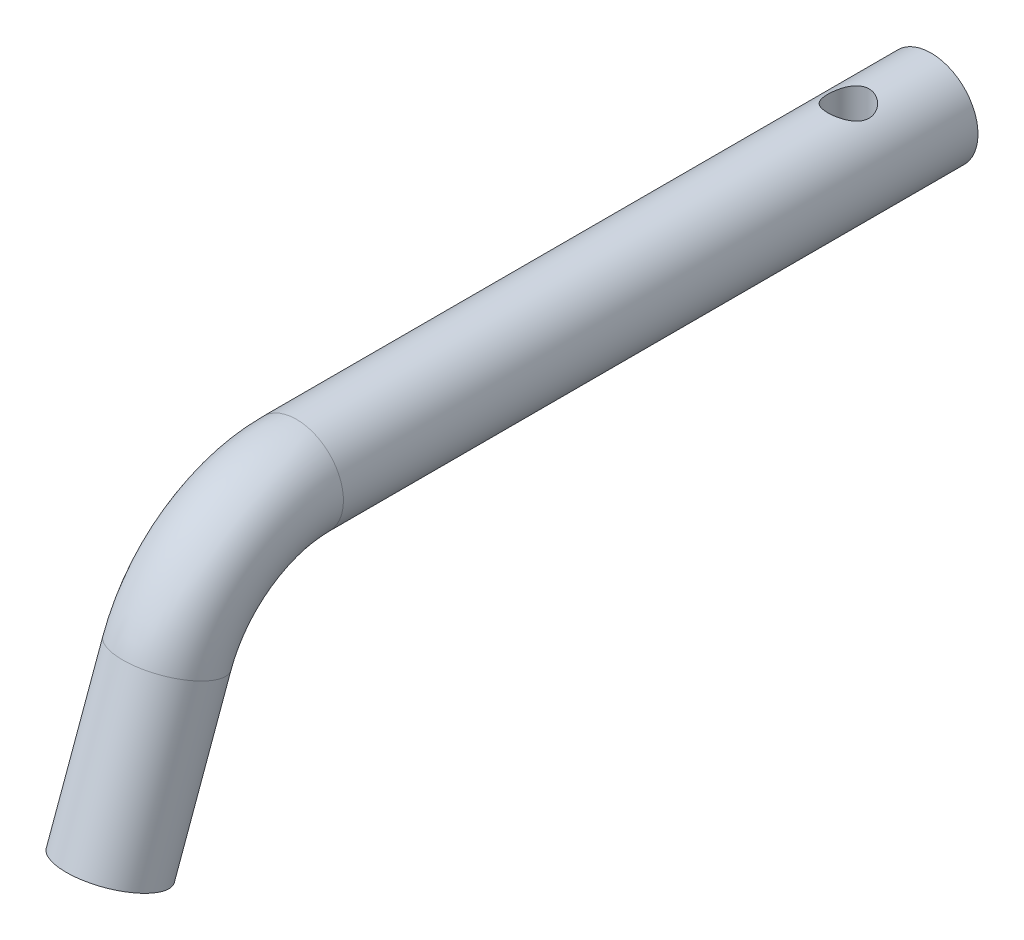
ISO-10303-21;
HEADER;
FILE_DESCRIPTION(('STEP AP214'),'2;1');
FILE_NAME('part.step','',(''),(''),'','','');
FILE_SCHEMA(('AUTOMOTIVE_DESIGN { 1 0 10303 214 1 1 1 1 }'));
ENDSEC;
DATA;
#1=APPLICATION_CONTEXT('core data for automotive mechanical design processes');
#2=APPLICATION_PROTOCOL_DEFINITION('international standard','automotive_design',2000,#1);
#3=PRODUCT_CONTEXT('',#1,'mechanical');
#4=PRODUCT('Part','Part','',(#3));
#5=PRODUCT_RELATED_PRODUCT_CATEGORY('part','',(#4));
#6=PRODUCT_DEFINITION_FORMATION('','',#4);
#7=PRODUCT_DEFINITION_CONTEXT('part definition',#1,'design');
#8=PRODUCT_DEFINITION('design','',#6,#7);
#9=PRODUCT_DEFINITION_SHAPE('','',#8);
#10=(LENGTH_UNIT() NAMED_UNIT(*) SI_UNIT(.MILLI.,.METRE.));
#11=(NAMED_UNIT(*) PLANE_ANGLE_UNIT() SI_UNIT($,.RADIAN.));
#12=(NAMED_UNIT(*) SI_UNIT($,.STERADIAN.) SOLID_ANGLE_UNIT());
#13=UNCERTAINTY_MEASURE_WITH_UNIT(LENGTH_MEASURE(1.E-05),#10,'distance_accuracy_value','');
#14=(GEOMETRIC_REPRESENTATION_CONTEXT(3) GLOBAL_UNCERTAINTY_ASSIGNED_CONTEXT((#13)) GLOBAL_UNIT_ASSIGNED_CONTEXT((#10,
#11,#12)) REPRESENTATION_CONTEXT('',''));
#15=CARTESIAN_POINT('',(0.,0.,0.));
#16=DIRECTION('',(0.,0.,1.));
#17=DIRECTION('',(1.,0.,0.));
#18=AXIS2_PLACEMENT_3D('',#15,#16,#17);
#19=CARTESIAN_POINT('',(0.,-16.4494964168584,138.492315519648));
#20=DIRECTION('',(0.,-0.93969262078591,0.342020143325665));
#21=DIRECTION('',(0.,-0.342020143325665,-0.93969262078591));
#22=AXIS2_PLACEMENT_3D('',#19,#20,#21);
#23=CYLINDRICAL_SURFACE('',#22,8.5);
#24=CARTESIAN_POINT('',(0.,-16.4494964168584,138.492315519648));
#25=DIRECTION('',(0.,-0.93969262078591,0.342020143325665));
#26=DIRECTION('',(1.,0.,0.));
#27=AXIS2_PLACEMENT_3D('',#24,#25,#26);
#28=CIRCLE('',#27,8.5);
#29=CARTESIAN_POINT('',(0.,-13.5423251985902,146.479702796328));
#30=VERTEX_POINT('',#29);
#31=EDGE_CURVE('E53',#30,#30,#28,.T.);
#32=ORIENTED_EDGE('',*,*,#31,.T.);
#33=EDGE_LOOP('',(#32));
#34=FACE_BOUND('',#33,.T.);
#35=CARTESIAN_POINT('',(0.,-44.6402750404357,148.752919819418));
#36=DIRECTION('',(0.,-0.93969262078591,0.342020143325665));
#37=DIRECTION('',(1.,0.,0.));
#38=AXIS2_PLACEMENT_3D('',#35,#36,#37);
#39=CIRCLE('',#38,8.5);
#40=CARTESIAN_POINT('',(8.5,-44.6402750404357,148.752919819418));
#41=VERTEX_POINT('',#40);
#42=EDGE_CURVE('E49',#41,#41,#39,.T.);
#43=ORIENTED_EDGE('',*,*,#42,.F.);
#44=EDGE_LOOP('',(#43));
#45=FACE_BOUND('',#44,.T.);
#46=ADVANCED_FACE('F37',(#34,#45),#23,.T.);
#47=CARTESIAN_POINT('',(0.,-25.,115.));
#48=DIRECTION('',(1.,0.,0.));
#49=DIRECTION('',(0.,0.,-1.));
#50=AXIS2_PLACEMENT_3D('',#47,#48,#49);
#51=TOROIDAL_SURFACE('',#50,25.,8.5);
#52=CARTESIAN_POINT('',(0.,0.,115.));
#53=DIRECTION('',(0.,0.,1.));
#54=DIRECTION('',(1.,0.,0.));
#55=AXIS2_PLACEMENT_3D('',#52,#53,#54);
#56=CIRCLE('',#55,8.5);
#57=CARTESIAN_POINT('',(0.,8.49999999999999,115.));
#58=VERTEX_POINT('',#57);
#59=EDGE_CURVE('E90',#58,#58,#56,.T.);
#60=CARTESIAN_POINT('',(0.,-25.,115.));
#61=DIRECTION('',(1.,0.,0.));
#62=DIRECTION('',(0.,0.,-1.));
#63=AXIS2_PLACEMENT_3D('',#60,#61,#62);
#64=CIRCLE('',#63,33.5);
#65=EDGE_CURVE('',#58,#30,#64,.T.);
#66=ORIENTED_EDGE('',*,*,#59,.T.);
#67=ORIENTED_EDGE('',*,*,#31,.F.);
#68=ORIENTED_EDGE('',*,*,#65,.T.);
#69=ORIENTED_EDGE('',*,*,#65,.F.);
#70=EDGE_LOOP('',(#66,#68,#67,#69));
#71=FACE_BOUND('',#70,.T.);
#72=ADVANCED_FACE('F79',(#71),#51,.T.);
#73=CARTESIAN_POINT('',(0.,0.,115.));
#74=DIRECTION('',(0.,0.,-1.));
#75=DIRECTION('',(0.,1.,0.));
#76=AXIS2_PLACEMENT_3D('',#73,#74,#75);
#77=CYLINDRICAL_SURFACE('',#76,8.5);
#78=CARTESIAN_POINT('',(0.,-8.5,18.75));
#79=CARTESIAN_POINT('',(0.0999558976515022,-8.49999935890844,18.7499992165375));
#80=CARTESIAN_POINT('',(0.199938526379386,-8.49823205416327,18.7459980516516));
#81=CARTESIAN_POINT('',(0.399183516955161,-8.49120739478633,18.7300338361352));
#82=CARTESIAN_POINT('',(0.498445428381363,-8.48594802055516,18.7180661781622));
#83=CARTESIAN_POINT('',(0.695663635366223,-8.47206199154958,18.6862638765181));
#84=CARTESIAN_POINT('',(0.793617095184538,-8.4634289644243,18.666414343956));
#85=CARTESIAN_POINT('',(0.987335915486304,-8.44302561349137,18.6190648021609));
#86=CARTESIAN_POINT('',(1.08310036413597,-8.43125400726226,18.5915616654686));
#87=CARTESIAN_POINT('',(1.36536799465597,-8.39175944741005,18.4981932684078));
#88=CARTESIAN_POINT('',(1.54777205362462,-8.35978735058802,18.421317012223));
#89=CARTESIAN_POINT('',(1.89680123675244,-8.2875822552758,18.2408834354046));
#90=CARTESIAN_POINT('',(2.06343008478846,-8.24735121352229,18.1373324331624));
#91=CARTESIAN_POINT('',(2.38574183002125,-8.16011458963587,17.9004620037884));
#92=CARTESIAN_POINT('',(2.54045490901277,-8.11287026790121,17.765908860382));
#93=CARTESIAN_POINT('',(2.82595491106934,-8.01789678469788,17.4735229534303));
#94=CARTESIAN_POINT('',(2.95672777935503,-7.97016735567651,17.3156766125287));
#95=CARTESIAN_POINT('',(3.19806253729727,-7.87655504691387,16.9701930209436));
#96=CARTESIAN_POINT('',(3.30705849547739,-7.83093021787193,16.7813742375152));
#97=CARTESIAN_POINT('',(3.44519682735577,-7.77065881681289,16.4849427900086));
#98=CARTESIAN_POINT('',(3.48702786737058,-7.75192386235585,16.3838916167599));
#99=CARTESIAN_POINT('',(3.56184065756976,-7.71783542854859,16.1780319851647));
#100=CARTESIAN_POINT('',(3.59482713302895,-7.70248014437289,16.0732255671525));
#101=CARTESIAN_POINT('',(3.65009428542046,-7.67643776880823,15.8661416684697));
#102=CARTESIAN_POINT('',(3.67283981158459,-7.66555057387276,15.764013041574));
#103=CARTESIAN_POINT('',(3.70974132852589,-7.64776048916769,15.5579157445523));
#104=CARTESIAN_POINT('',(3.72390143607776,-7.64085568988609,15.4539479809598));
#105=CARTESIAN_POINT('',(3.74345607757862,-7.63129451113794,15.2450311062506));
#106=CARTESIAN_POINT('',(3.74885356936061,-7.62863669810012,15.1400823383091));
#107=CARTESIAN_POINT('',(3.75081817583424,-7.62767097179327,14.9300868455599));
#108=CARTESIAN_POINT('',(3.74738584478112,-7.62936278549458,14.8250401273143));
#109=CARTESIAN_POINT('',(3.73242909578796,-7.63669005315726,14.6250012500233));
#110=CARTESIAN_POINT('',(3.72164546598027,-7.64196433893136,14.5299398184955));
#111=CARTESIAN_POINT('',(3.69290492351594,-7.65589310970095,14.341148080794));
#112=CARTESIAN_POINT('',(3.67494557684926,-7.6645487416301,14.2474182374793));
#113=CARTESIAN_POINT('',(3.61056059616382,-7.69520483570085,13.9692223515304));
#114=CARTESIAN_POINT('',(3.55361569812134,-7.72190105753058,13.7875896262777));
#115=CARTESIAN_POINT('',(3.41221100228373,-7.78542812649254,13.4326118958773));
#116=CARTESIAN_POINT('',(3.32716517690193,-7.82247197340192,13.259542532202));
#117=CARTESIAN_POINT('',(3.13237733872992,-7.90248622936272,12.9293801271241));
#118=CARTESIAN_POINT('',(3.02262499680422,-7.94545911426965,12.7722938078042));
#119=CARTESIAN_POINT('',(2.76921917904785,-8.03749074755006,12.4627429086084));
#120=CARTESIAN_POINT('',(2.62332475403702,-8.08673805046123,12.3121640900223));
#121=CARTESIAN_POINT('',(2.30793105087729,-8.18233433196054,12.0369318947019));
#122=CARTESIAN_POINT('',(2.13842486512249,-8.22868245662534,11.9122861313725));
#123=CARTESIAN_POINT('',(1.77429726877549,-8.31491541320456,11.6892265367902));
#124=CARTESIAN_POINT('',(1.57909441508011,-8.35457641986542,11.5916687886325));
#125=CARTESIAN_POINT('',(1.17284827377196,-8.42120408617829,11.4314542934501));
#126=CARTESIAN_POINT('',(0.961814917162525,-8.44817862851834,11.368775869837));
#127=CARTESIAN_POINT('',(0.545572567034578,-8.4848660971578,11.2842511022284));
#128=CARTESIAN_POINT('',(0.34097020009136,-8.49564384062029,11.2598805476027));
#129=CARTESIAN_POINT('',(-0.069671784856444,-8.50219123341189,11.2450279123634));
#130=CARTESIAN_POINT('',(-0.275710901369676,-8.4979658811345,11.2545345453155));
#131=CARTESIAN_POINT('',(-0.670962912504121,-8.47565881454487,11.3054425486727));
#132=CARTESIAN_POINT('',(-0.860465069754504,-8.45838152374964,11.344993001697));
#133=CARTESIAN_POINT('',(-1.22988898871197,-8.41261192414812,11.4522006067444));
#134=CARTESIAN_POINT('',(-1.40980957708042,-8.3841182453756,11.5198611921864));
#135=CARTESIAN_POINT('',(-1.76133981641855,-8.31749375261046,11.6835331871615));
#136=CARTESIAN_POINT('',(-1.93251447834152,-8.27908977737579,11.7803639528322));
#137=CARTESIAN_POINT('',(-2.25680322751843,-8.1966383461109,11.998734409101));
#138=CARTESIAN_POINT('',(-2.40990942865911,-8.15258844324293,12.1202848262058));
#139=CARTESIAN_POINT('',(-2.70654737016301,-8.05919775645556,12.3959109766456));
#140=CARTESIAN_POINT('',(-2.84834947334488,-8.00971479421856,12.5518045540581));
#141=CARTESIAN_POINT('',(-3.10434954534258,-7.91402140254101,12.8858085266052));
#142=CARTESIAN_POINT('',(-3.21853818425967,-7.86781208290058,13.0639264000442));
#143=CARTESIAN_POINT('',(-3.41821787179742,-7.78317756039911,13.4427242312809));
#144=CARTESIAN_POINT('',(-3.50301255907517,-7.74494881212248,13.6438185829936));
#145=CARTESIAN_POINT('',(-3.63673708808501,-7.68307681597586,14.059667718774));
#146=CARTESIAN_POINT('',(-3.68570136436534,-7.6594195677457,14.2744091710605));
#147=CARTESIAN_POINT('',(-3.74276718935772,-7.63168450286916,14.6920569788805));
#148=CARTESIAN_POINT('',(-3.75395229151973,-7.62613057654858,14.894444807125));
#149=CARTESIAN_POINT('',(-3.74357450489929,-7.63123131644185,15.2981478901567));
#150=CARTESIAN_POINT('',(-3.72201832834107,-7.6418826604463,15.4994633562967));
#151=CARTESIAN_POINT('',(-3.64945758892465,-7.67677775776882,15.8830974988726));
#152=CARTESIAN_POINT('',(-3.60024726823411,-7.70019095208435,16.0658388566717));
#153=CARTESIAN_POINT('',(-3.47565066045343,-7.75722372486009,16.420457287311));
#154=CARTESIAN_POINT('',(-3.40025683324557,-7.79084624296918,16.5923312137636));
#155=CARTESIAN_POINT('',(-3.21993866713778,-7.86715632020434,16.9323182742139));
#156=CARTESIAN_POINT('',(-3.11343955972522,-7.91028479661963,17.0994949499752));
#157=CARTESIAN_POINT('',(-2.87598916098658,-7.99967257547854,17.4145657071466));
#158=CARTESIAN_POINT('',(-2.74502784967624,-8.04593315589791,17.5624518446345));
#159=CARTESIAN_POINT('',(-2.44913699902211,-8.14112380534496,17.8478104515863));
#160=CARTESIAN_POINT('',(-2.28225859179774,-8.18994305579371,17.9833054544907));
#161=CARTESIAN_POINT('',(-1.92628705297231,-8.28088398675045,18.2246042962354));
#162=CARTESIAN_POINT('',(-1.73718385857852,-8.32300261292277,18.3303946115435));
#163=CARTESIAN_POINT('',(-1.44198693930203,-8.3773872098492,18.4633357172594));
#164=CARTESIAN_POINT('',(-1.34224253171041,-8.39398240698358,18.503209035849));
#165=CARTESIAN_POINT('',(-1.13927944161895,-8.42392616470049,18.5743646102972));
#166=CARTESIAN_POINT('',(-1.03606245576769,-8.43727628528846,18.6056509950897));
#167=CARTESIAN_POINT('',(-0.827193701401068,-8.46030568706053,18.6592149035209));
#168=CARTESIAN_POINT('',(-0.721548429974336,-8.46999377402647,18.68151404669));
#169=CARTESIAN_POINT('',(-0.508498079058491,-8.48544740593806,18.7169307630779));
#170=CARTESIAN_POINT('',(-0.401094284380561,-8.49121569433241,18.7300547581257));
#171=CARTESIAN_POINT('',(-0.244522866709495,-8.496622648825,18.7423395282259));
#172=CARTESIAN_POINT('',(-0.195673881887684,-8.49788817743547,18.7452111116587));
#173=CARTESIAN_POINT('',(-0.0978854018766624,-8.49957701437847,18.7490415493418));
#174=CARTESIAN_POINT('',(-0.0489459057487437,-8.50000031392652,18.750000383642));
#175=CARTESIAN_POINT('',(0.,-8.5,18.75));
#176=B_SPLINE_CURVE_WITH_KNOTS('',3,(#78,#79,#80,#81,#82,#83,#84,#85,#86,#87,#88,#89,#90,#91,
#92,#93,#94,#95,#96,#97,#98,#99,#100,#101,#102,#103,#104,#105,#106,#107,#108,#109,#110,#111,
#112,#113,#114,#115,#116,#117,#118,#119,#120,#121,#122,#123,#124,#125,#126,#127,#128,#129,#130,
#131,#132,#133,#134,#135,#136,#137,#138,#139,#140,#141,#142,#143,#144,#145,#146,#147,#148,#149,
#150,#151,#152,#153,#154,#155,#156,#157,#158,#159,#160,#161,#162,#163,#164,#165,#166,#167,#168,
#169,#170,#171,#172,#173,#174,#175),.UNSPECIFIED.,.T.,.F.,(4,2,2,2,2,2,2,2,2,2,2,2,2,2,2,2,2,2,
2,2,2,2,2,2,2,2,2,2,2,2,2,2,2,2,2,2,2,2,2,2,2,2,2,2,2,2,2,2,4),(0.,0.299818228155887,
0.5998100040471,0.900371182145584,1.2010553580616,1.79963485823413,2.39807270429569,
3.0265612136215,3.65541751989825,4.31992187733338,4.65242211464622,4.98474435565086,
5.29990700195235,5.61491840556023,5.92982345451068,6.24470873709456,6.53180791841118,
6.81900456683259,7.39292104602401,7.97965340763086,8.56663152345543,9.20986440394263,
9.85328585856622,10.5151842460743,11.1766708203272,11.792407717755,12.4079394970828,
12.9883480709219,13.5688275576954,14.1674342192119,14.7663011882598,15.4127921708918,
16.0595012824107,16.7206247381209,17.3811119886363,17.9861875871415,18.5911391570472,
19.1607438084726,19.7305126263103,20.3365642719615,20.942864709498,21.6011058822365,
22.2596462456553,22.5853613259069,22.9109195141152,23.2356898032882,23.560232552491,
23.7070445168134,23.8538580123836),.UNSPECIFIED.);
#177=CARTESIAN_POINT('',(0.,-8.5,18.75));
#178=VERTEX_POINT('',#177);
#179=EDGE_CURVE('E40',#178,#178,#176,.T.);
#180=ORIENTED_EDGE('',*,*,#179,.T.);
#181=EDGE_LOOP('',(#180));
#182=FACE_BOUND('',#181,.T.);
#183=CARTESIAN_POINT('',(0.,8.49999999999999,18.75));
#184=CARTESIAN_POINT('',(-0.0999558976515029,8.49999935890842,18.7499992165375));
#185=CARTESIAN_POINT('',(-0.199938526379387,8.49823205416326,18.7459980516516));
#186=CARTESIAN_POINT('',(-0.399183516955163,8.49120739478633,18.7300338361352));
#187=CARTESIAN_POINT('',(-0.498445428381365,8.48594802055516,18.7180661781622));
#188=CARTESIAN_POINT('',(-0.695663635366226,8.47206199154958,18.6862638765181));
#189=CARTESIAN_POINT('',(-0.793617095184541,8.46342896442429,18.666414343956));
#190=CARTESIAN_POINT('',(-0.987335915486308,8.44302561349137,18.6190648021609));
#191=CARTESIAN_POINT('',(-1.08310036413597,8.43125400726226,18.5915616654686));
#192=CARTESIAN_POINT('',(-1.36536799465597,8.39175944741005,18.4981932684078));
#193=CARTESIAN_POINT('',(-1.54777205362463,8.35978735058802,18.421317012223));
#194=CARTESIAN_POINT('',(-1.89680123675245,8.2875822552758,18.2408834354046));
#195=CARTESIAN_POINT('',(-2.06343008478847,8.24735121352229,18.1373324331624));
#196=CARTESIAN_POINT('',(-2.38574183002125,8.16011458963586,17.9004620037884));
#197=CARTESIAN_POINT('',(-2.54045490901277,8.1128702679012,17.765908860382));
#198=CARTESIAN_POINT('',(-2.82595491106934,8.01789678469788,17.4735229534303));
#199=CARTESIAN_POINT('',(-2.95672777935504,7.97016735567651,17.3156766125287));
#200=CARTESIAN_POINT('',(-3.19806253729728,7.87655504691387,16.9701930209436));
#201=CARTESIAN_POINT('',(-3.3070584954774,7.83093021787193,16.7813742375152));
#202=CARTESIAN_POINT('',(-3.44519682735577,7.77065881681288,16.4849427900086));
#203=CARTESIAN_POINT('',(-3.48702786737059,7.75192386235585,16.3838916167599));
#204=CARTESIAN_POINT('',(-3.56184065756977,7.71783542854859,16.1780319851646));
#205=CARTESIAN_POINT('',(-3.59482713302895,7.70248014437288,16.0732255671525));
#206=CARTESIAN_POINT('',(-3.65009428542046,7.67643776880822,15.8661416684696));
#207=CARTESIAN_POINT('',(-3.67283981158459,7.66555057387275,15.764013041574));
#208=CARTESIAN_POINT('',(-3.70974132852589,7.64776048916769,15.5579157445522));
#209=CARTESIAN_POINT('',(-3.72390143607776,7.64085568988608,15.4539479809598));
#210=CARTESIAN_POINT('',(-3.74345607757862,7.63129451113794,15.2450311062506));
#211=CARTESIAN_POINT('',(-3.74885356936061,7.62863669810012,15.1400823383091));
#212=CARTESIAN_POINT('',(-3.75081817583424,7.62767097179327,14.9300868455599));
#213=CARTESIAN_POINT('',(-3.74738584478111,7.62936278549457,14.8250401273143));
#214=CARTESIAN_POINT('',(-3.73242909578796,7.63669005315726,14.6250012500233));
#215=CARTESIAN_POINT('',(-3.72164546598027,7.64196433893135,14.5299398184955));
#216=CARTESIAN_POINT('',(-3.69290492351594,7.65589310970095,14.341148080794));
#217=CARTESIAN_POINT('',(-3.67494557684926,7.66454874163009,14.2474182374793));
#218=CARTESIAN_POINT('',(-3.61056059616382,7.69520483570084,13.9692223515304));
#219=CARTESIAN_POINT('',(-3.55361569812134,7.72190105753057,13.7875896262777));
#220=CARTESIAN_POINT('',(-3.41221100228372,7.78542812649254,13.4326118958773));
#221=CARTESIAN_POINT('',(-3.32716517690193,7.82247197340192,13.259542532202));
#222=CARTESIAN_POINT('',(-3.13237733872992,7.90248622936272,12.9293801271241));
#223=CARTESIAN_POINT('',(-3.02262499680422,7.94545911426965,12.7722938078042));
#224=CARTESIAN_POINT('',(-2.76921917904785,8.03749074755006,12.4627429086084));
#225=CARTESIAN_POINT('',(-2.62332475403703,8.08673805046123,12.3121640900223));
#226=CARTESIAN_POINT('',(-2.30793105087729,8.18233433196054,12.0369318947019));
#227=CARTESIAN_POINT('',(-2.13842486512249,8.22868245662533,11.9122861313725));
#228=CARTESIAN_POINT('',(-1.77429726877549,8.31491541320455,11.6892265367902));
#229=CARTESIAN_POINT('',(-1.57909441508011,8.35457641986542,11.5916687886325));
#230=CARTESIAN_POINT('',(-1.17284827377196,8.42120408617829,11.4314542934501));
#231=CARTESIAN_POINT('',(-0.961814917162527,8.44817862851833,11.368775869837));
#232=CARTESIAN_POINT('',(-0.54557256703458,8.4848660971578,11.2842511022284));
#233=CARTESIAN_POINT('',(-0.340970200091362,8.49564384062029,11.2598805476027));
#234=CARTESIAN_POINT('',(0.0696717848564434,8.50219123341189,11.2450279123634));
#235=CARTESIAN_POINT('',(0.275710901369676,8.4979658811345,11.2545345453155));
#236=CARTESIAN_POINT('',(0.670962912504123,8.47565881454486,11.3054425486727));
#237=CARTESIAN_POINT('',(0.860465069754507,8.45838152374963,11.344993001697));
#238=CARTESIAN_POINT('',(1.22988898871198,8.41261192414812,11.4522006067444));
#239=CARTESIAN_POINT('',(1.40980957708043,8.38411824537559,11.5198611921864));
#240=CARTESIAN_POINT('',(1.76133981641855,8.31749375261045,11.6835331871615));
#241=CARTESIAN_POINT('',(1.93251447834153,8.27908977737579,11.7803639528322));
#242=CARTESIAN_POINT('',(2.25680322751844,8.19663834611089,11.998734409101));
#243=CARTESIAN_POINT('',(2.40990942865911,8.15258844324293,12.1202848262058));
#244=CARTESIAN_POINT('',(2.70654737016302,8.05919775645555,12.3959109766456));
#245=CARTESIAN_POINT('',(2.84834947334489,8.00971479421855,12.5518045540581));
#246=CARTESIAN_POINT('',(3.10434954534259,7.91402140254101,12.8858085266052));
#247=CARTESIAN_POINT('',(3.21853818425967,7.86781208290057,13.0639264000442));
#248=CARTESIAN_POINT('',(3.41821787179743,7.7831775603991,13.4427242312809));
#249=CARTESIAN_POINT('',(3.50301255907517,7.74494881212248,13.6438185829937));
#250=CARTESIAN_POINT('',(3.63673708808501,7.68307681597586,14.0596677187741));
#251=CARTESIAN_POINT('',(3.68570136436535,7.65941956774569,14.2744091710605));
#252=CARTESIAN_POINT('',(3.74276718935772,7.63168450286916,14.6920569788805));
#253=CARTESIAN_POINT('',(3.75395229151973,7.62613057654858,14.894444807125));
#254=CARTESIAN_POINT('',(3.74357450489929,7.63123131644185,15.2981478901567));
#255=CARTESIAN_POINT('',(3.72201832834106,7.6418826604463,15.4994633562967));
#256=CARTESIAN_POINT('',(3.64945758892465,7.67677775776882,15.8830974988726));
#257=CARTESIAN_POINT('',(3.60024726823411,7.70019095208435,16.0658388566717));
#258=CARTESIAN_POINT('',(3.47565066045343,7.75722372486008,16.420457287311));
#259=CARTESIAN_POINT('',(3.40025683324557,7.79084624296917,16.5923312137636));
#260=CARTESIAN_POINT('',(3.21993866713779,7.86715632020434,16.9323182742139));
#261=CARTESIAN_POINT('',(3.11343955972523,7.91028479661963,17.0994949499752));
#262=CARTESIAN_POINT('',(2.87598916098658,7.99967257547854,17.4145657071466));
#263=CARTESIAN_POINT('',(2.74502784967624,8.04593315589791,17.5624518446345));
#264=CARTESIAN_POINT('',(2.44913699902211,8.14112380534495,17.8478104515863));
#265=CARTESIAN_POINT('',(2.28225859179774,8.18994305579371,17.9833054544907));
#266=CARTESIAN_POINT('',(1.92628705297232,8.28088398675045,18.2246042962354));
#267=CARTESIAN_POINT('',(1.73718385857852,8.32300261292277,18.3303946115435));
#268=CARTESIAN_POINT('',(1.44198693930203,8.3773872098492,18.4633357172594));
#269=CARTESIAN_POINT('',(1.34224253171041,8.39398240698358,18.503209035849));
#270=CARTESIAN_POINT('',(1.13927944161895,8.42392616470048,18.5743646102972));
#271=CARTESIAN_POINT('',(1.03606245576769,8.43727628528846,18.6056509950897));
#272=CARTESIAN_POINT('',(0.827193701401074,8.46030568706053,18.6592149035209));
#273=CARTESIAN_POINT('',(0.721548429974342,8.46999377402647,18.68151404669));
#274=CARTESIAN_POINT('',(0.508498079058496,8.48544740593805,18.7169307630779));
#275=CARTESIAN_POINT('',(0.401094284380566,8.49121569433241,18.7300547581257));
#276=CARTESIAN_POINT('',(0.244522866709497,8.496622648825,18.7423395282259));
#277=CARTESIAN_POINT('',(0.195673881887685,8.49788817743547,18.7452111116587));
#278=CARTESIAN_POINT('',(0.0978854018766624,8.49957701437846,18.7490415493418));
#279=CARTESIAN_POINT('',(0.0489459057487437,8.50000031392651,18.750000383642));
#280=CARTESIAN_POINT('',(0.,8.49999999999999,18.75));
#281=B_SPLINE_CURVE_WITH_KNOTS('',3,(#183,#184,#185,#186,#187,#188,#189,#190,#191,#192,#193,
#194,#195,#196,#197,#198,#199,#200,#201,#202,#203,#204,#205,#206,#207,#208,#209,#210,#211,#212,
#213,#214,#215,#216,#217,#218,#219,#220,#221,#222,#223,#224,#225,#226,#227,#228,#229,#230,#231,
#232,#233,#234,#235,#236,#237,#238,#239,#240,#241,#242,#243,#244,#245,#246,#247,#248,#249,#250,
#251,#252,#253,#254,#255,#256,#257,#258,#259,#260,#261,#262,#263,#264,#265,#266,#267,#268,#269,
#270,#271,#272,#273,#274,#275,#276,#277,#278,#279,#280),.UNSPECIFIED.,.T.,.F.,(4,2,2,2,2,2,2,2,
2,2,2,2,2,2,2,2,2,2,2,2,2,2,2,2,2,2,2,2,2,2,2,2,2,2,2,2,2,2,2,2,2,2,2,2,2,2,2,2,4),(0.,
0.299818228155889,0.599810004047102,0.900371182145588,1.2010553580616,1.79963485823413,
2.3980727042957,3.02656121362151,3.65541751989826,4.31992187733339,4.65242211464624,
4.98474435565087,5.29990700195236,5.61491840556024,5.92982345451069,6.24470873709457,
6.53180791841119,6.8190045668326,7.39292104602401,7.97965340763086,8.56663152345543,
9.20986440394262,9.85328585856622,10.5151842460743,11.1766708203272,11.792407717755,
12.4079394970828,12.9883480709219,13.5688275576954,14.1674342192119,14.7663011882598,
15.4127921708918,16.0595012824107,16.7206247381209,17.3811119886363,17.9861875871415,
18.5911391570472,19.1607438084727,19.7305126263103,20.3365642719615,20.942864709498,
21.6011058822365,22.2596462456553,22.5853613259069,22.9109195141152,23.2356898032882,
23.560232552491,23.7070445168134,23.8538580123836),.UNSPECIFIED.);
#282=CARTESIAN_POINT('',(0.,8.49999999999999,18.75));
#283=VERTEX_POINT('',#282);
#284=EDGE_CURVE('E10',#283,#283,#281,.T.);
#285=ORIENTED_EDGE('',*,*,#284,.T.);
#286=EDGE_LOOP('',(#285));
#287=FACE_BOUND('',#286,.T.);
#288=ORIENTED_EDGE('',*,*,#59,.F.);
#289=EDGE_LOOP('',(#288));
#290=FACE_BOUND('',#289,.T.);
#291=CARTESIAN_POINT('',(0.,0.,0.));
#292=DIRECTION('',(0.,0.,1.));
#293=DIRECTION('',(1.,0.,0.));
#294=AXIS2_PLACEMENT_3D('',#291,#292,#293);
#295=CIRCLE('',#294,8.5);
#296=CARTESIAN_POINT('',(8.5,0.,0.));
#297=VERTEX_POINT('',#296);
#298=EDGE_CURVE('E92',#297,#297,#295,.T.);
#299=ORIENTED_EDGE('',*,*,#298,.T.);
#300=EDGE_LOOP('',(#299));
#301=FACE_BOUND('',#300,.T.);
#302=ADVANCED_FACE('F59',(#182,#287,#290,#301),#77,.T.);
#303=CARTESIAN_POINT('',(0.,-44.6402750404357,148.752919819418));
#304=DIRECTION('',(0.,-0.93969262078591,0.342020143325665));
#305=DIRECTION('',(1.,0.,0.));
#306=AXIS2_PLACEMENT_3D('',#303,#304,#305);
#307=PLANE('',#306);
#308=ORIENTED_EDGE('',*,*,#42,.T.);
#309=EDGE_LOOP('',(#308));
#310=FACE_BOUND('',#309,.T.);
#311=ADVANCED_FACE('F68',(#310),#307,.T.);
#312=CARTESIAN_POINT('',(0.,0.,0.));
#313=DIRECTION('',(0.,0.,1.));
#314=DIRECTION('',(1.,0.,0.));
#315=AXIS2_PLACEMENT_3D('',#312,#313,#314);
#316=PLANE('',#315);
#317=ORIENTED_EDGE('',*,*,#298,.F.);
#318=EDGE_LOOP('',(#317));
#319=FACE_BOUND('',#318,.T.);
#320=ADVANCED_FACE('F66',(#319),#316,.F.);
#321=CARTESIAN_POINT('',(0.,-47.5474462587038,15.));
#322=DIRECTION('',(0.,1.,0.));
#323=DIRECTION('',(0.,0.,1.));
#324=AXIS2_PLACEMENT_3D('',#321,#322,#323);
#325=CYLINDRICAL_SURFACE('',#324,3.75);
#326=ORIENTED_EDGE('',*,*,#179,.F.);
#327=EDGE_LOOP('',(#326));
#328=FACE_BOUND('',#327,.T.);
#329=ORIENTED_EDGE('',*,*,#284,.F.);
#330=EDGE_LOOP('',(#329));
#331=FACE_BOUND('',#330,.T.);
#332=ADVANCED_FACE('F62',(#328,#331),#325,.F.);
#333=CLOSED_SHELL('',(#46,#72,#302,#311,#320,#332));
#334=MANIFOLD_SOLID_BREP('B2',#333);
#335=ADVANCED_BREP_SHAPE_REPRESENTATION('',(#18,#334),#14);
#336=SHAPE_DEFINITION_REPRESENTATION(#9,#335);
ENDSEC;
END-ISO-10303-21;
